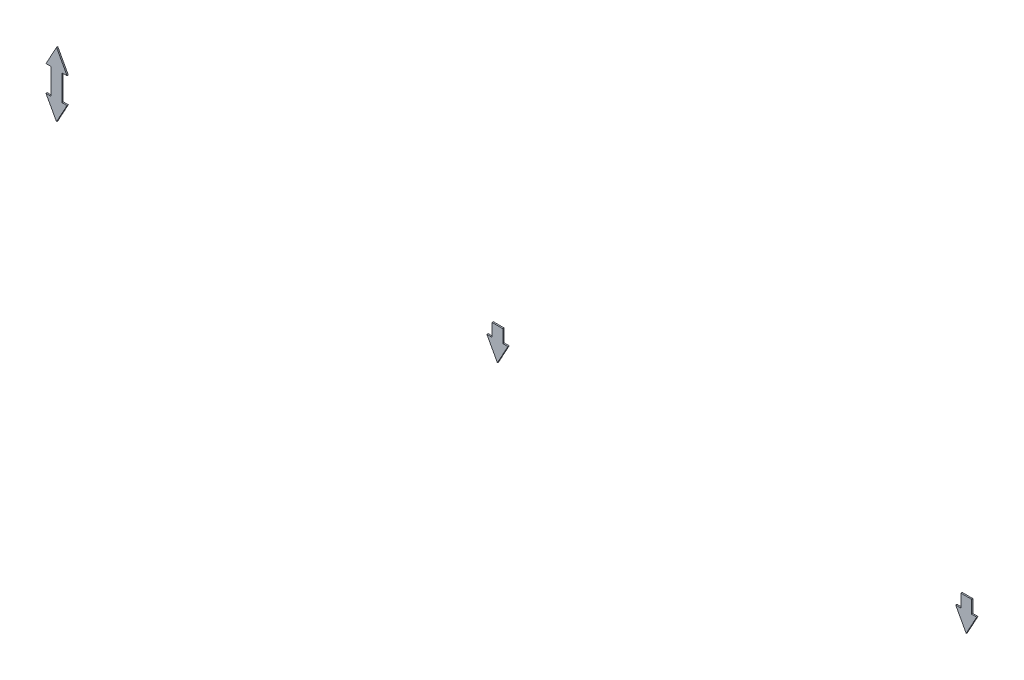
ISO-10303-21;
HEADER;
FILE_DESCRIPTION(('STEP AP214'),'2;1');
FILE_NAME('part.step','',(''),(''),'','','');
FILE_SCHEMA(('AUTOMOTIVE_DESIGN { 1 0 10303 214 1 1 1 1 }'));
ENDSEC;
DATA;
#1=APPLICATION_CONTEXT('core data for automotive mechanical design processes');
#2=APPLICATION_PROTOCOL_DEFINITION('international standard','automotive_design',2000,#1);
#3=PRODUCT_CONTEXT('',#1,'mechanical');
#4=PRODUCT('Part','Part','',(#3));
#5=PRODUCT_RELATED_PRODUCT_CATEGORY('part','',(#4));
#6=PRODUCT_DEFINITION_FORMATION('','',#4);
#7=PRODUCT_DEFINITION_CONTEXT('part definition',#1,'design');
#8=PRODUCT_DEFINITION('design','',#6,#7);
#9=PRODUCT_DEFINITION_SHAPE('','',#8);
#10=(LENGTH_UNIT() NAMED_UNIT(*) SI_UNIT(.MILLI.,.METRE.));
#11=(NAMED_UNIT(*) PLANE_ANGLE_UNIT() SI_UNIT($,.RADIAN.));
#12=(NAMED_UNIT(*) SI_UNIT($,.STERADIAN.) SOLID_ANGLE_UNIT());
#13=UNCERTAINTY_MEASURE_WITH_UNIT(LENGTH_MEASURE(1.E-05),#10,'distance_accuracy_value','');
#14=(GEOMETRIC_REPRESENTATION_CONTEXT(3) GLOBAL_UNCERTAINTY_ASSIGNED_CONTEXT((#13)) GLOBAL_UNIT_ASSIGNED_CONTEXT((#10,
#11,#12)) REPRESENTATION_CONTEXT('',''));
#15=CARTESIAN_POINT('',(0.,0.,0.));
#16=DIRECTION('',(0.,0.,1.));
#17=DIRECTION('',(1.,0.,0.));
#18=AXIS2_PLACEMENT_3D('',#15,#16,#17);
#19=CARTESIAN_POINT('',(28365.5486184684,1498.65057848952,30.));
#20=DIRECTION('',(0.,-1.,0.));
#21=DIRECTION('',(0.,0.,-1.));
#22=AXIS2_PLACEMENT_3D('',#19,#20,#21);
#23=PLANE('',#22);
#24=DIRECTION('',(-1.,0.,0.));
#25=VECTOR('',#24,1.);
#26=CARTESIAN_POINT('',(28365.5486184684,1498.65057848952,0.));
#27=LINE('',#26,#25);
#28=CARTESIAN_POINT('',(28615.5486184684,1498.65057848952,0.));
#29=VERTEX_POINT('',#28);
#30=CARTESIAN_POINT('',(28365.5486184684,1498.65057848952,0.));
#31=VERTEX_POINT('',#30);
#32=EDGE_CURVE('E134',#29,#31,#27,.T.);
#33=ORIENTED_EDGE('',*,*,#32,.T.);
#34=DIRECTION('',(0.,0.,-1.));
#35=VECTOR('',#34,1.);
#36=CARTESIAN_POINT('',(28365.5486184684,1498.65057848952,30.));
#37=LINE('',#36,#35);
#38=CARTESIAN_POINT('',(28365.5486184684,1498.65057848952,30.));
#39=VERTEX_POINT('',#38);
#40=EDGE_CURVE('E12',#39,#31,#37,.T.);
#41=ORIENTED_EDGE('',*,*,#40,.F.);
#42=DIRECTION('',(-1.,0.,0.));
#43=VECTOR('',#42,1.);
#44=CARTESIAN_POINT('',(28365.5486184684,1498.65057848952,30.));
#45=LINE('',#44,#43);
#46=CARTESIAN_POINT('',(28615.5486184684,1498.65057848952,30.));
#47=VERTEX_POINT('',#46);
#48=EDGE_CURVE('E146',#47,#39,#45,.T.);
#49=ORIENTED_EDGE('',*,*,#48,.F.);
#50=DIRECTION('',(0.,0.,-1.));
#51=VECTOR('',#50,1.);
#52=CARTESIAN_POINT('',(28615.5486184684,1498.65057848952,30.));
#53=LINE('',#52,#51);
#54=EDGE_CURVE('E130',#47,#29,#53,.T.);
#55=ORIENTED_EDGE('',*,*,#54,.T.);
#56=EDGE_LOOP('',(#33,#41,#49,#55));
#57=FACE_BOUND('',#56,.T.);
#58=ADVANCED_FACE('F44',(#57),#23,.F.);
#59=CARTESIAN_POINT('',(28365.5486184684,1198.65057848952,30.));
#60=DIRECTION('',(1.,0.,0.));
#61=DIRECTION('',(0.,0.,-1.));
#62=AXIS2_PLACEMENT_3D('',#59,#60,#61);
#63=PLANE('',#62);
#64=DIRECTION('',(0.,-1.,0.));
#65=VECTOR('',#64,1.);
#66=CARTESIAN_POINT('',(28365.5486184684,1198.65057848952,0.));
#67=LINE('',#66,#65);
#68=CARTESIAN_POINT('',(28365.5486184684,1198.65057848952,0.));
#69=VERTEX_POINT('',#68);
#70=EDGE_CURVE('E137',#31,#69,#67,.T.);
#71=ORIENTED_EDGE('',*,*,#70,.T.);
#72=DIRECTION('',(0.,0.,-1.));
#73=VECTOR('',#72,1.);
#74=CARTESIAN_POINT('',(28365.5486184684,1198.65057848952,30.));
#75=LINE('',#74,#73);
#76=CARTESIAN_POINT('',(28365.5486184684,1198.65057848952,30.));
#77=VERTEX_POINT('',#76);
#78=EDGE_CURVE('E52',#77,#69,#75,.T.);
#79=ORIENTED_EDGE('',*,*,#78,.F.);
#80=DIRECTION('',(0.,-1.,0.));
#81=VECTOR('',#80,1.);
#82=CARTESIAN_POINT('',(28365.5486184684,1198.65057848952,30.));
#83=LINE('',#82,#81);
#84=EDGE_CURVE('E100',#39,#77,#83,.T.);
#85=ORIENTED_EDGE('',*,*,#84,.F.);
#86=ORIENTED_EDGE('',*,*,#40,.T.);
#87=EDGE_LOOP('',(#71,#79,#85,#86));
#88=FACE_BOUND('',#87,.T.);
#89=ADVANCED_FACE('F171',(#88),#63,.F.);
#90=CARTESIAN_POINT('',(28365.5486184684,1198.65057848952,30.));
#91=DIRECTION('',(0.,-1.,0.));
#92=DIRECTION('',(0.,0.,-1.));
#93=AXIS2_PLACEMENT_3D('',#90,#91,#92);
#94=PLANE('',#93);
#95=DIRECTION('',(-1.,0.,0.));
#96=VECTOR('',#95,1.);
#97=CARTESIAN_POINT('',(28365.5486184684,1198.65057848952,0.));
#98=LINE('',#97,#96);
#99=CARTESIAN_POINT('',(28246.1263767895,1198.65057848952,0.));
#100=VERTEX_POINT('',#99);
#101=EDGE_CURVE('E139',#69,#100,#98,.T.);
#102=ORIENTED_EDGE('',*,*,#101,.T.);
#103=DIRECTION('',(0.,0.,-1.));
#104=VECTOR('',#103,1.);
#105=CARTESIAN_POINT('',(28246.1263767895,1198.65057848952,30.));
#106=LINE('',#105,#104);
#107=CARTESIAN_POINT('',(28246.1263767895,1198.65057848952,30.));
#108=VERTEX_POINT('',#107);
#109=EDGE_CURVE('E150',#108,#100,#106,.T.);
#110=ORIENTED_EDGE('',*,*,#109,.F.);
#111=DIRECTION('',(-1.,0.,0.));
#112=VECTOR('',#111,1.);
#113=CARTESIAN_POINT('',(28365.5486184684,1198.65057848952,30.));
#114=LINE('',#113,#112);
#115=EDGE_CURVE('E158',#77,#108,#114,.T.);
#116=ORIENTED_EDGE('',*,*,#115,.F.);
#117=ORIENTED_EDGE('',*,*,#78,.T.);
#118=EDGE_LOOP('',(#102,#110,#116,#117));
#119=FACE_BOUND('',#118,.T.);
#120=ADVANCED_FACE('F156',(#119),#94,.F.);
#121=CARTESIAN_POINT('',(28246.1263767895,1198.65057848952,30.));
#122=DIRECTION('',(0.878295572504541,0.478118068387841,0.));
#123=DIRECTION('',(-0.478118068387841,0.878295572504541,0.));
#124=AXIS2_PLACEMENT_3D('',#121,#122,#123);
#125=PLANE('',#124);
#126=DIRECTION('',(0.478118068387841,-0.878295572504541,0.));
#127=VECTOR('',#126,1.);
#128=CARTESIAN_POINT('',(28246.1263767895,1198.65057848952,0.));
#129=LINE('',#128,#127);
#130=CARTESIAN_POINT('',(28490.5486184684,749.650662188248,0.));
#131=VERTEX_POINT('',#130);
#132=EDGE_CURVE('E141',#100,#131,#129,.T.);
#133=ORIENTED_EDGE('',*,*,#132,.T.);
#134=DIRECTION('',(0.,0.,-1.));
#135=VECTOR('',#134,1.);
#136=CARTESIAN_POINT('',(28490.5486184684,749.650662188248,30.));
#137=LINE('',#136,#135);
#138=CARTESIAN_POINT('',(28490.5486184684,749.650662188248,30.));
#139=VERTEX_POINT('',#138);
#140=EDGE_CURVE('E125',#139,#131,#137,.T.);
#141=ORIENTED_EDGE('',*,*,#140,.F.);
#142=DIRECTION('',(0.478118068387841,-0.878295572504541,0.));
#143=VECTOR('',#142,1.);
#144=CARTESIAN_POINT('',(28246.1263767895,1198.65057848952,30.));
#145=LINE('',#144,#143);
#146=EDGE_CURVE('E116',#108,#139,#145,.T.);
#147=ORIENTED_EDGE('',*,*,#146,.F.);
#148=ORIENTED_EDGE('',*,*,#109,.T.);
#149=EDGE_LOOP('',(#133,#141,#147,#148));
#150=FACE_BOUND('',#149,.T.);
#151=ADVANCED_FACE('F164',(#150),#125,.F.);
#152=CARTESIAN_POINT('',(28734.9708601474,1198.65057848952,30.));
#153=DIRECTION('',(-0.878295572504541,0.478118068387841,0.));
#154=DIRECTION('',(-0.478118068387841,-0.878295572504541,0.));
#155=AXIS2_PLACEMENT_3D('',#152,#153,#154);
#156=PLANE('',#155);
#157=DIRECTION('',(0.478118068387841,0.878295572504541,0.));
#158=VECTOR('',#157,1.);
#159=CARTESIAN_POINT('',(28734.9708601474,1198.65057848952,0.));
#160=LINE('',#159,#158);
#161=CARTESIAN_POINT('',(28734.9708601474,1198.65057848952,0.));
#162=VERTEX_POINT('',#161);
#163=EDGE_CURVE('E124',#131,#162,#160,.T.);
#164=ORIENTED_EDGE('',*,*,#163,.T.);
#165=DIRECTION('',(0.,0.,-1.));
#166=VECTOR('',#165,1.);
#167=CARTESIAN_POINT('',(28734.9708601474,1198.65057848952,30.));
#168=LINE('',#167,#166);
#169=CARTESIAN_POINT('',(28734.9708601474,1198.65057848952,30.));
#170=VERTEX_POINT('',#169);
#171=EDGE_CURVE('E121',#170,#162,#168,.T.);
#172=ORIENTED_EDGE('',*,*,#171,.F.);
#173=DIRECTION('',(0.478118068387841,0.878295572504541,0.));
#174=VECTOR('',#173,1.);
#175=CARTESIAN_POINT('',(28734.9708601474,1198.65057848952,30.));
#176=LINE('',#175,#174);
#177=EDGE_CURVE('E110',#139,#170,#176,.T.);
#178=ORIENTED_EDGE('',*,*,#177,.F.);
#179=ORIENTED_EDGE('',*,*,#140,.T.);
#180=EDGE_LOOP('',(#164,#172,#178,#179));
#181=FACE_BOUND('',#180,.T.);
#182=ADVANCED_FACE('F122',(#181),#156,.F.);
#183=CARTESIAN_POINT('',(28615.5486184684,1198.65057848952,30.));
#184=DIRECTION('',(0.,-1.,0.));
#185=DIRECTION('',(0.,0.,-1.));
#186=AXIS2_PLACEMENT_3D('',#183,#184,#185);
#187=PLANE('',#186);
#188=DIRECTION('',(-1.,0.,0.));
#189=VECTOR('',#188,1.);
#190=CARTESIAN_POINT('',(28615.5486184684,1198.65057848952,0.));
#191=LINE('',#190,#189);
#192=CARTESIAN_POINT('',(28615.5486184684,1198.65057848952,0.));
#193=VERTEX_POINT('',#192);
#194=EDGE_CURVE('E86',#162,#193,#191,.T.);
#195=ORIENTED_EDGE('',*,*,#194,.T.);
#196=DIRECTION('',(0.,0.,-1.));
#197=VECTOR('',#196,1.);
#198=CARTESIAN_POINT('',(28615.5486184684,1198.65057848952,30.));
#199=LINE('',#198,#197);
#200=CARTESIAN_POINT('',(28615.5486184684,1198.65057848952,30.));
#201=VERTEX_POINT('',#200);
#202=EDGE_CURVE('E126',#201,#193,#199,.T.);
#203=ORIENTED_EDGE('',*,*,#202,.F.);
#204=DIRECTION('',(-1.,0.,0.));
#205=VECTOR('',#204,1.);
#206=CARTESIAN_POINT('',(28615.5486184684,1198.65057848952,30.));
#207=LINE('',#206,#205);
#208=EDGE_CURVE('E114',#170,#201,#207,.T.);
#209=ORIENTED_EDGE('',*,*,#208,.F.);
#210=ORIENTED_EDGE('',*,*,#171,.T.);
#211=EDGE_LOOP('',(#195,#203,#209,#210));
#212=FACE_BOUND('',#211,.T.);
#213=ADVANCED_FACE('F128',(#212),#187,.F.);
#214=CARTESIAN_POINT('',(28615.5486184684,1198.65057848952,30.));
#215=DIRECTION('',(-1.,0.,0.));
#216=DIRECTION('',(0.,0.,1.));
#217=AXIS2_PLACEMENT_3D('',#214,#215,#216);
#218=PLANE('',#217);
#219=DIRECTION('',(0.,1.,0.));
#220=VECTOR('',#219,1.);
#221=CARTESIAN_POINT('',(28615.5486184684,1198.65057848952,0.));
#222=LINE('',#221,#220);
#223=EDGE_CURVE('E92',#193,#29,#222,.T.);
#224=ORIENTED_EDGE('',*,*,#223,.T.);
#225=ORIENTED_EDGE('',*,*,#54,.F.);
#226=DIRECTION('',(0.,1.,0.));
#227=VECTOR('',#226,1.);
#228=CARTESIAN_POINT('',(28615.5486184684,1198.65057848952,30.));
#229=LINE('',#228,#227);
#230=EDGE_CURVE('E60',#201,#47,#229,.T.);
#231=ORIENTED_EDGE('',*,*,#230,.F.);
#232=ORIENTED_EDGE('',*,*,#202,.T.);
#233=EDGE_LOOP('',(#224,#225,#231,#232));
#234=FACE_BOUND('',#233,.T.);
#235=ADVANCED_FACE('F185',(#234),#218,.F.);
#236=CARTESIAN_POINT('',(28615.5486184684,1498.65057848952,30.));
#237=DIRECTION('',(0.,0.,1.));
#238=DIRECTION('',(1.,0.,0.));
#239=AXIS2_PLACEMENT_3D('',#236,#237,#238);
#240=PLANE('',#239);
#241=ORIENTED_EDGE('',*,*,#48,.T.);
#242=ORIENTED_EDGE('',*,*,#84,.T.);
#243=ORIENTED_EDGE('',*,*,#115,.T.);
#244=ORIENTED_EDGE('',*,*,#146,.T.);
#245=ORIENTED_EDGE('',*,*,#177,.T.);
#246=ORIENTED_EDGE('',*,*,#208,.T.);
#247=ORIENTED_EDGE('',*,*,#230,.T.);
#248=EDGE_LOOP('',(#241,#242,#243,#244,#245,#246,#247));
#249=FACE_BOUND('',#248,.T.);
#250=ADVANCED_FACE('F112',(#249),#240,.T.);
#251=CARTESIAN_POINT('',(28615.5486184684,1498.65057848952,0.));
#252=DIRECTION('',(0.,0.,1.));
#253=DIRECTION('',(1.,0.,0.));
#254=AXIS2_PLACEMENT_3D('',#251,#252,#253);
#255=PLANE('',#254);
#256=ORIENTED_EDGE('',*,*,#32,.F.);
#257=ORIENTED_EDGE('',*,*,#223,.F.);
#258=ORIENTED_EDGE('',*,*,#194,.F.);
#259=ORIENTED_EDGE('',*,*,#163,.F.);
#260=ORIENTED_EDGE('',*,*,#132,.F.);
#261=ORIENTED_EDGE('',*,*,#101,.F.);
#262=ORIENTED_EDGE('',*,*,#70,.F.);
#263=EDGE_LOOP('',(#256,#257,#258,#259,#260,#261,#262));
#264=FACE_BOUND('',#263,.T.);
#265=ADVANCED_FACE('F162',(#264),#255,.F.);
#266=CLOSED_SHELL('',(#58,#89,#120,#151,#182,#213,#235,#250,#265));
#267=MANIFOLD_SOLID_BREP('B2',#266);
#268=CARTESIAN_POINT('',(17465.5486184684,1498.65057848952,30.));
#269=DIRECTION('',(0.,-1.,0.));
#270=DIRECTION('',(0.,0.,-1.));
#271=AXIS2_PLACEMENT_3D('',#268,#269,#270);
#272=PLANE('',#271);
#273=DIRECTION('',(-1.,0.,0.));
#274=VECTOR('',#273,1.);
#275=CARTESIAN_POINT('',(17465.5486184684,1498.65057848952,0.));
#276=LINE('',#275,#274);
#277=CARTESIAN_POINT('',(17715.5486184684,1498.65057848952,0.));
#278=VERTEX_POINT('',#277);
#279=CARTESIAN_POINT('',(17465.5486184684,1498.65057848952,0.));
#280=VERTEX_POINT('',#279);
#281=EDGE_CURVE('E345',#278,#280,#276,.T.);
#282=ORIENTED_EDGE('',*,*,#281,.T.);
#283=DIRECTION('',(0.,0.,-1.));
#284=VECTOR('',#283,1.);
#285=CARTESIAN_POINT('',(17465.5486184684,1498.65057848952,30.));
#286=LINE('',#285,#284);
#287=CARTESIAN_POINT('',(17465.5486184684,1498.65057848952,30.));
#288=VERTEX_POINT('',#287);
#289=EDGE_CURVE('E42',#288,#280,#286,.T.);
#290=ORIENTED_EDGE('',*,*,#289,.F.);
#291=DIRECTION('',(-1.,0.,0.));
#292=VECTOR('',#291,1.);
#293=CARTESIAN_POINT('',(17465.5486184684,1498.65057848952,30.));
#294=LINE('',#293,#292);
#295=CARTESIAN_POINT('',(17715.5486184684,1498.65057848952,30.));
#296=VERTEX_POINT('',#295);
#297=EDGE_CURVE('E357',#296,#288,#294,.T.);
#298=ORIENTED_EDGE('',*,*,#297,.F.);
#299=DIRECTION('',(0.,0.,-1.));
#300=VECTOR('',#299,1.);
#301=CARTESIAN_POINT('',(17715.5486184684,1498.65057848952,30.));
#302=LINE('',#301,#300);
#303=EDGE_CURVE('E341',#296,#278,#302,.T.);
#304=ORIENTED_EDGE('',*,*,#303,.T.);
#305=EDGE_LOOP('',(#282,#290,#298,#304));
#306=FACE_BOUND('',#305,.T.);
#307=ADVANCED_FACE('F255',(#306),#272,.F.);
#308=CARTESIAN_POINT('',(17465.5486184684,1198.65057848952,30.));
#309=DIRECTION('',(1.,0.,0.));
#310=DIRECTION('',(0.,0.,-1.));
#311=AXIS2_PLACEMENT_3D('',#308,#309,#310);
#312=PLANE('',#311);
#313=DIRECTION('',(0.,-1.,0.));
#314=VECTOR('',#313,1.);
#315=CARTESIAN_POINT('',(17465.5486184684,1198.65057848952,0.));
#316=LINE('',#315,#314);
#317=CARTESIAN_POINT('',(17465.5486184684,1198.65057848952,0.));
#318=VERTEX_POINT('',#317);
#319=EDGE_CURVE('E348',#280,#318,#316,.T.);
#320=ORIENTED_EDGE('',*,*,#319,.T.);
#321=DIRECTION('',(0.,0.,-1.));
#322=VECTOR('',#321,1.);
#323=CARTESIAN_POINT('',(17465.5486184684,1198.65057848952,30.));
#324=LINE('',#323,#322);
#325=CARTESIAN_POINT('',(17465.5486184684,1198.65057848952,30.));
#326=VERTEX_POINT('',#325);
#327=EDGE_CURVE('E263',#326,#318,#324,.T.);
#328=ORIENTED_EDGE('',*,*,#327,.F.);
#329=DIRECTION('',(0.,-1.,0.));
#330=VECTOR('',#329,1.);
#331=CARTESIAN_POINT('',(17465.5486184684,1198.65057848952,30.));
#332=LINE('',#331,#330);
#333=EDGE_CURVE('E311',#288,#326,#332,.T.);
#334=ORIENTED_EDGE('',*,*,#333,.F.);
#335=ORIENTED_EDGE('',*,*,#289,.T.);
#336=EDGE_LOOP('',(#320,#328,#334,#335));
#337=FACE_BOUND('',#336,.T.);
#338=ADVANCED_FACE('F382',(#337),#312,.F.);
#339=CARTESIAN_POINT('',(17465.5486184684,1198.65057848952,30.));
#340=DIRECTION('',(0.,-1.,0.));
#341=DIRECTION('',(0.,0.,-1.));
#342=AXIS2_PLACEMENT_3D('',#339,#340,#341);
#343=PLANE('',#342);
#344=DIRECTION('',(-1.,0.,0.));
#345=VECTOR('',#344,1.);
#346=CARTESIAN_POINT('',(17465.5486184684,1198.65057848952,0.));
#347=LINE('',#346,#345);
#348=CARTESIAN_POINT('',(17346.1263767895,1198.65057848952,0.));
#349=VERTEX_POINT('',#348);
#350=EDGE_CURVE('E350',#318,#349,#347,.T.);
#351=ORIENTED_EDGE('',*,*,#350,.T.);
#352=DIRECTION('',(0.,0.,-1.));
#353=VECTOR('',#352,1.);
#354=CARTESIAN_POINT('',(17346.1263767895,1198.65057848952,30.));
#355=LINE('',#354,#353);
#356=CARTESIAN_POINT('',(17346.1263767895,1198.65057848952,30.));
#357=VERTEX_POINT('',#356);
#358=EDGE_CURVE('E361',#357,#349,#355,.T.);
#359=ORIENTED_EDGE('',*,*,#358,.F.);
#360=DIRECTION('',(-1.,0.,0.));
#361=VECTOR('',#360,1.);
#362=CARTESIAN_POINT('',(17465.5486184684,1198.65057848952,30.));
#363=LINE('',#362,#361);
#364=EDGE_CURVE('E369',#326,#357,#363,.T.);
#365=ORIENTED_EDGE('',*,*,#364,.F.);
#366=ORIENTED_EDGE('',*,*,#327,.T.);
#367=EDGE_LOOP('',(#351,#359,#365,#366));
#368=FACE_BOUND('',#367,.T.);
#369=ADVANCED_FACE('F367',(#368),#343,.F.);
#370=CARTESIAN_POINT('',(17346.1263767895,1198.65057848952,30.));
#371=DIRECTION('',(0.878295572504541,0.478118068387841,0.));
#372=DIRECTION('',(-0.478118068387841,0.878295572504541,0.));
#373=AXIS2_PLACEMENT_3D('',#370,#371,#372);
#374=PLANE('',#373);
#375=DIRECTION('',(0.478118068387841,-0.878295572504541,0.));
#376=VECTOR('',#375,1.);
#377=CARTESIAN_POINT('',(17346.1263767895,1198.65057848952,0.));
#378=LINE('',#377,#376);
#379=CARTESIAN_POINT('',(17590.5486184684,749.650662188248,0.));
#380=VERTEX_POINT('',#379);
#381=EDGE_CURVE('E352',#349,#380,#378,.T.);
#382=ORIENTED_EDGE('',*,*,#381,.T.);
#383=DIRECTION('',(0.,0.,-1.));
#384=VECTOR('',#383,1.);
#385=CARTESIAN_POINT('',(17590.5486184684,749.650662188248,30.));
#386=LINE('',#385,#384);
#387=CARTESIAN_POINT('',(17590.5486184684,749.650662188248,30.));
#388=VERTEX_POINT('',#387);
#389=EDGE_CURVE('E336',#388,#380,#386,.T.);
#390=ORIENTED_EDGE('',*,*,#389,.F.);
#391=DIRECTION('',(0.478118068387841,-0.878295572504541,0.));
#392=VECTOR('',#391,1.);
#393=CARTESIAN_POINT('',(17346.1263767895,1198.65057848952,30.));
#394=LINE('',#393,#392);
#395=EDGE_CURVE('E327',#357,#388,#394,.T.);
#396=ORIENTED_EDGE('',*,*,#395,.F.);
#397=ORIENTED_EDGE('',*,*,#358,.T.);
#398=EDGE_LOOP('',(#382,#390,#396,#397));
#399=FACE_BOUND('',#398,.T.);
#400=ADVANCED_FACE('F375',(#399),#374,.F.);
#401=CARTESIAN_POINT('',(17834.9708601474,1198.65057848952,30.));
#402=DIRECTION('',(-0.878295572504541,0.478118068387841,0.));
#403=DIRECTION('',(-0.478118068387841,-0.878295572504541,0.));
#404=AXIS2_PLACEMENT_3D('',#401,#402,#403);
#405=PLANE('',#404);
#406=DIRECTION('',(0.478118068387841,0.878295572504541,0.));
#407=VECTOR('',#406,1.);
#408=CARTESIAN_POINT('',(17834.9708601474,1198.65057848952,0.));
#409=LINE('',#408,#407);
#410=CARTESIAN_POINT('',(17834.9708601474,1198.65057848952,0.));
#411=VERTEX_POINT('',#410);
#412=EDGE_CURVE('E335',#380,#411,#409,.T.);
#413=ORIENTED_EDGE('',*,*,#412,.T.);
#414=DIRECTION('',(0.,0.,-1.));
#415=VECTOR('',#414,1.);
#416=CARTESIAN_POINT('',(17834.9708601474,1198.65057848952,30.));
#417=LINE('',#416,#415);
#418=CARTESIAN_POINT('',(17834.9708601474,1198.65057848952,30.));
#419=VERTEX_POINT('',#418);
#420=EDGE_CURVE('E332',#419,#411,#417,.T.);
#421=ORIENTED_EDGE('',*,*,#420,.F.);
#422=DIRECTION('',(0.478118068387841,0.878295572504541,0.));
#423=VECTOR('',#422,1.);
#424=CARTESIAN_POINT('',(17834.9708601474,1198.65057848952,30.));
#425=LINE('',#424,#423);
#426=EDGE_CURVE('E321',#388,#419,#425,.T.);
#427=ORIENTED_EDGE('',*,*,#426,.F.);
#428=ORIENTED_EDGE('',*,*,#389,.T.);
#429=EDGE_LOOP('',(#413,#421,#427,#428));
#430=FACE_BOUND('',#429,.T.);
#431=ADVANCED_FACE('F333',(#430),#405,.F.);
#432=CARTESIAN_POINT('',(17715.5486184684,1198.65057848952,30.));
#433=DIRECTION('',(0.,-1.,0.));
#434=DIRECTION('',(0.,0.,-1.));
#435=AXIS2_PLACEMENT_3D('',#432,#433,#434);
#436=PLANE('',#435);
#437=DIRECTION('',(-1.,0.,0.));
#438=VECTOR('',#437,1.);
#439=CARTESIAN_POINT('',(17715.5486184684,1198.65057848952,0.));
#440=LINE('',#439,#438);
#441=CARTESIAN_POINT('',(17715.5486184684,1198.65057848952,0.));
#442=VERTEX_POINT('',#441);
#443=EDGE_CURVE('E297',#411,#442,#440,.T.);
#444=ORIENTED_EDGE('',*,*,#443,.T.);
#445=DIRECTION('',(0.,0.,-1.));
#446=VECTOR('',#445,1.);
#447=CARTESIAN_POINT('',(17715.5486184684,1198.65057848952,30.));
#448=LINE('',#447,#446);
#449=CARTESIAN_POINT('',(17715.5486184684,1198.65057848952,30.));
#450=VERTEX_POINT('',#449);
#451=EDGE_CURVE('E337',#450,#442,#448,.T.);
#452=ORIENTED_EDGE('',*,*,#451,.F.);
#453=DIRECTION('',(-1.,0.,0.));
#454=VECTOR('',#453,1.);
#455=CARTESIAN_POINT('',(17715.5486184684,1198.65057848952,30.));
#456=LINE('',#455,#454);
#457=EDGE_CURVE('E325',#419,#450,#456,.T.);
#458=ORIENTED_EDGE('',*,*,#457,.F.);
#459=ORIENTED_EDGE('',*,*,#420,.T.);
#460=EDGE_LOOP('',(#444,#452,#458,#459));
#461=FACE_BOUND('',#460,.T.);
#462=ADVANCED_FACE('F339',(#461),#436,.F.);
#463=CARTESIAN_POINT('',(17715.5486184684,1198.65057848952,30.));
#464=DIRECTION('',(-1.,0.,0.));
#465=DIRECTION('',(0.,0.,1.));
#466=AXIS2_PLACEMENT_3D('',#463,#464,#465);
#467=PLANE('',#466);
#468=DIRECTION('',(0.,1.,0.));
#469=VECTOR('',#468,1.);
#470=CARTESIAN_POINT('',(17715.5486184684,1198.65057848952,0.));
#471=LINE('',#470,#469);
#472=EDGE_CURVE('E303',#442,#278,#471,.T.);
#473=ORIENTED_EDGE('',*,*,#472,.T.);
#474=ORIENTED_EDGE('',*,*,#303,.F.);
#475=DIRECTION('',(0.,1.,0.));
#476=VECTOR('',#475,1.);
#477=CARTESIAN_POINT('',(17715.5486184684,1198.65057848952,30.));
#478=LINE('',#477,#476);
#479=EDGE_CURVE('E271',#450,#296,#478,.T.);
#480=ORIENTED_EDGE('',*,*,#479,.F.);
#481=ORIENTED_EDGE('',*,*,#451,.T.);
#482=EDGE_LOOP('',(#473,#474,#480,#481));
#483=FACE_BOUND('',#482,.T.);
#484=ADVANCED_FACE('F396',(#483),#467,.F.);
#485=CARTESIAN_POINT('',(17715.5486184684,1498.65057848952,30.));
#486=DIRECTION('',(0.,0.,1.));
#487=DIRECTION('',(1.,0.,0.));
#488=AXIS2_PLACEMENT_3D('',#485,#486,#487);
#489=PLANE('',#488);
#490=ORIENTED_EDGE('',*,*,#297,.T.);
#491=ORIENTED_EDGE('',*,*,#333,.T.);
#492=ORIENTED_EDGE('',*,*,#364,.T.);
#493=ORIENTED_EDGE('',*,*,#395,.T.);
#494=ORIENTED_EDGE('',*,*,#426,.T.);
#495=ORIENTED_EDGE('',*,*,#457,.T.);
#496=ORIENTED_EDGE('',*,*,#479,.T.);
#497=EDGE_LOOP('',(#490,#491,#492,#493,#494,#495,#496));
#498=FACE_BOUND('',#497,.T.);
#499=ADVANCED_FACE('F323',(#498),#489,.T.);
#500=CARTESIAN_POINT('',(17715.5486184684,1498.65057848952,0.));
#501=DIRECTION('',(0.,0.,1.));
#502=DIRECTION('',(1.,0.,0.));
#503=AXIS2_PLACEMENT_3D('',#500,#501,#502);
#504=PLANE('',#503);
#505=ORIENTED_EDGE('',*,*,#281,.F.);
#506=ORIENTED_EDGE('',*,*,#472,.F.);
#507=ORIENTED_EDGE('',*,*,#443,.F.);
#508=ORIENTED_EDGE('',*,*,#412,.F.);
#509=ORIENTED_EDGE('',*,*,#381,.F.);
#510=ORIENTED_EDGE('',*,*,#350,.F.);
#511=ORIENTED_EDGE('',*,*,#319,.F.);
#512=EDGE_LOOP('',(#505,#506,#507,#508,#509,#510,#511));
#513=FACE_BOUND('',#512,.T.);
#514=ADVANCED_FACE('F373',(#513),#504,.F.);
#515=CLOSED_SHELL('',(#307,#338,#369,#400,#431,#462,#484,#499,#514));
#516=MANIFOLD_SOLID_BREP('B6',#515);
#517=CARTESIAN_POINT('',(7464.0512415667,1525.53062986048,30.));
#518=DIRECTION('',(0.,1.,0.));
#519=DIRECTION('',(0.,0.,1.));
#520=AXIS2_PLACEMENT_3D('',#517,#518,#519);
#521=PLANE('',#520);
#522=DIRECTION('',(1.,0.,0.));
#523=VECTOR('',#522,1.);
#524=CARTESIAN_POINT('',(7464.0512415667,1525.53062986048,0.));
#525=LINE('',#524,#523);
#526=CARTESIAN_POINT('',(7464.0512415667,1525.53062986048,0.));
#527=VERTEX_POINT('',#526);
#528=CARTESIAN_POINT('',(7583.47348324566,1525.53062986048,0.));
#529=VERTEX_POINT('',#528);
#530=EDGE_CURVE('E565',#527,#529,#525,.T.);
#531=ORIENTED_EDGE('',*,*,#530,.T.);
#532=DIRECTION('',(0.,0.,-1.));
#533=VECTOR('',#532,1.);
#534=CARTESIAN_POINT('',(7583.47348324566,1525.53062986048,30.));
#535=LINE('',#534,#533);
#536=CARTESIAN_POINT('',(7583.47348324566,1525.53062986048,30.));
#537=VERTEX_POINT('',#536);
#538=EDGE_CURVE('E253',#537,#529,#535,.T.);
#539=ORIENTED_EDGE('',*,*,#538,.F.);
#540=DIRECTION('',(1.,0.,0.));
#541=VECTOR('',#540,1.);
#542=CARTESIAN_POINT('',(7464.0512415667,1525.53062986048,30.));
#543=LINE('',#542,#541);
#544=CARTESIAN_POINT('',(7464.0512415667,1525.53062986048,30.));
#545=VERTEX_POINT('',#544);
#546=EDGE_CURVE('E583',#545,#537,#543,.T.);
#547=ORIENTED_EDGE('',*,*,#546,.F.);
#548=DIRECTION('',(0.,0.,-1.));
#549=VECTOR('',#548,1.);
#550=CARTESIAN_POINT('',(7464.0512415667,1525.53062986048,30.));
#551=LINE('',#550,#549);
#552=EDGE_CURVE('E561',#545,#527,#551,.T.);
#553=ORIENTED_EDGE('',*,*,#552,.T.);
#554=EDGE_LOOP('',(#531,#539,#547,#553));
#555=FACE_BOUND('',#554,.T.);
#556=ADVANCED_FACE('F457',(#555),#521,.F.);
#557=CARTESIAN_POINT('',(7583.47348324566,1525.53062986048,30.));
#558=DIRECTION('',(-0.878295572504543,-0.478118068387838,0.));
#559=DIRECTION('',(0.478118068387838,-0.878295572504543,0.));
#560=AXIS2_PLACEMENT_3D('',#557,#558,#559);
#561=PLANE('',#560);
#562=DIRECTION('',(-0.478118068387838,0.878295572504542,0.));
#563=VECTOR('',#562,1.);
#564=CARTESIAN_POINT('',(7583.47348324566,1525.53062986048,0.));
#565=LINE('',#564,#563);
#566=CARTESIAN_POINT('',(7339.0512415667,1974.53054616176,0.));
#567=VERTEX_POINT('',#566);
#568=EDGE_CURVE('E568',#529,#567,#565,.T.);
#569=ORIENTED_EDGE('',*,*,#568,.T.);
#570=DIRECTION('',(0.,0.,-1.));
#571=VECTOR('',#570,1.);
#572=CARTESIAN_POINT('',(7339.0512415667,1974.53054616176,30.));
#573=LINE('',#572,#571);
#574=CARTESIAN_POINT('',(7339.0512415667,1974.53054616176,30.));
#575=VERTEX_POINT('',#574);
#576=EDGE_CURVE('E465',#575,#567,#573,.T.);
#577=ORIENTED_EDGE('',*,*,#576,.F.);
#578=DIRECTION('',(-0.478118068387838,0.878295572504542,0.));
#579=VECTOR('',#578,1.);
#580=CARTESIAN_POINT('',(7583.47348324566,1525.53062986048,30.));
#581=LINE('',#580,#579);
#582=EDGE_CURVE('E522',#537,#575,#581,.T.);
#583=ORIENTED_EDGE('',*,*,#582,.F.);
#584=ORIENTED_EDGE('',*,*,#538,.T.);
#585=EDGE_LOOP('',(#569,#577,#583,#584));
#586=FACE_BOUND('',#585,.T.);
#587=ADVANCED_FACE('F632',(#586),#561,.F.);
#588=CARTESIAN_POINT('',(7094.62899988774,1525.53062986048,30.));
#589=DIRECTION('',(0.878295572504543,-0.478118068387838,0.));
#590=DIRECTION('',(0.478118068387838,0.878295572504543,0.));
#591=AXIS2_PLACEMENT_3D('',#588,#589,#590);
#592=PLANE('',#591);
#593=DIRECTION('',(-0.478118068387838,-0.878295572504542,0.));
#594=VECTOR('',#593,1.);
#595=CARTESIAN_POINT('',(7094.62899988774,1525.53062986048,0.));
#596=LINE('',#595,#594);
#597=CARTESIAN_POINT('',(7094.62899988774,1525.53062986048,0.));
#598=VERTEX_POINT('',#597);
#599=EDGE_CURVE('E570',#567,#598,#596,.T.);
#600=ORIENTED_EDGE('',*,*,#599,.T.);
#601=DIRECTION('',(0.,0.,-1.));
#602=VECTOR('',#601,1.);
#603=CARTESIAN_POINT('',(7094.62899988774,1525.53062986048,30.));
#604=LINE('',#603,#602);
#605=CARTESIAN_POINT('',(7094.62899988774,1525.53062986048,30.));
#606=VERTEX_POINT('',#605);
#607=EDGE_CURVE('E596',#606,#598,#604,.T.);
#608=ORIENTED_EDGE('',*,*,#607,.F.);
#609=DIRECTION('',(-0.478118068387838,-0.878295572504542,0.));
#610=VECTOR('',#609,1.);
#611=CARTESIAN_POINT('',(7094.62899988774,1525.53062986048,30.));
#612=LINE('',#611,#610);
#613=EDGE_CURVE('E604',#575,#606,#612,.T.);
#614=ORIENTED_EDGE('',*,*,#613,.F.);
#615=ORIENTED_EDGE('',*,*,#576,.T.);
#616=EDGE_LOOP('',(#600,#608,#614,#615));
#617=FACE_BOUND('',#616,.T.);
#618=ADVANCED_FACE('F602',(#617),#592,.F.);
#619=CARTESIAN_POINT('',(7214.0512415667,1525.53062986048,30.));
#620=DIRECTION('',(0.,1.,0.));
#621=DIRECTION('',(0.,0.,1.));
#622=AXIS2_PLACEMENT_3D('',#619,#620,#621);
#623=PLANE('',#622);
#624=DIRECTION('',(1.,0.,0.));
#625=VECTOR('',#624,1.);
#626=CARTESIAN_POINT('',(7214.0512415667,1525.53062986048,0.));
#627=LINE('',#626,#625);
#628=CARTESIAN_POINT('',(7214.0512415667,1525.53062986048,0.));
#629=VERTEX_POINT('',#628);
#630=EDGE_CURVE('E572',#598,#629,#627,.T.);
#631=ORIENTED_EDGE('',*,*,#630,.T.);
#632=DIRECTION('',(0.,0.,-1.));
#633=VECTOR('',#632,1.);
#634=CARTESIAN_POINT('',(7214.0512415667,1525.53062986048,30.));
#635=LINE('',#634,#633);
#636=CARTESIAN_POINT('',(7214.0512415667,1525.53062986048,30.));
#637=VERTEX_POINT('',#636);
#638=EDGE_CURVE('E593',#637,#629,#635,.T.);
#639=ORIENTED_EDGE('',*,*,#638,.F.);
#640=DIRECTION('',(1.,0.,0.));
#641=VECTOR('',#640,1.);
#642=CARTESIAN_POINT('',(7214.0512415667,1525.53062986048,30.));
#643=LINE('',#642,#641);
#644=EDGE_CURVE('E622',#606,#637,#643,.T.);
#645=ORIENTED_EDGE('',*,*,#644,.F.);
#646=ORIENTED_EDGE('',*,*,#607,.T.);
#647=EDGE_LOOP('',(#631,#639,#645,#646));
#648=FACE_BOUND('',#647,.T.);
#649=ADVANCED_FACE('F613',(#648),#623,.F.);
#650=CARTESIAN_POINT('',(7214.0512415667,925.530629860483,30.));
#651=DIRECTION('',(1.,0.,0.));
#652=DIRECTION('',(0.,0.,-1.));
#653=AXIS2_PLACEMENT_3D('',#650,#651,#652);
#654=PLANE('',#653);
#655=DIRECTION('',(0.,-1.,0.));
#656=VECTOR('',#655,1.);
#657=CARTESIAN_POINT('',(7214.0512415667,925.530629860483,0.));
#658=LINE('',#657,#656);
#659=CARTESIAN_POINT('',(7214.0512415667,925.530629860483,0.));
#660=VERTEX_POINT('',#659);
#661=EDGE_CURVE('E574',#629,#660,#658,.T.);
#662=ORIENTED_EDGE('',*,*,#661,.T.);
#663=DIRECTION('',(0.,0.,-1.));
#664=VECTOR('',#663,1.);
#665=CARTESIAN_POINT('',(7214.0512415667,925.530629860483,30.));
#666=LINE('',#665,#664);
#667=CARTESIAN_POINT('',(7214.0512415667,925.530629860483,30.));
#668=VERTEX_POINT('',#667);
#669=EDGE_CURVE('E590',#668,#660,#666,.T.);
#670=ORIENTED_EDGE('',*,*,#669,.F.);
#671=DIRECTION('',(0.,-1.,0.));
#672=VECTOR('',#671,1.);
#673=CARTESIAN_POINT('',(7214.0512415667,925.530629860483,30.));
#674=LINE('',#673,#672);
#675=EDGE_CURVE('E619',#637,#668,#674,.T.);
#676=ORIENTED_EDGE('',*,*,#675,.F.);
#677=ORIENTED_EDGE('',*,*,#638,.T.);
#678=EDGE_LOOP('',(#662,#670,#676,#677));
#679=FACE_BOUND('',#678,.T.);
#680=ADVANCED_FACE('F617',(#679),#654,.F.);
#681=CARTESIAN_POINT('',(7214.0512415667,925.530629860483,30.));
#682=DIRECTION('',(0.,-1.,0.));
#683=DIRECTION('',(0.,0.,-1.));
#684=AXIS2_PLACEMENT_3D('',#681,#682,#683);
#685=PLANE('',#684);
#686=DIRECTION('',(-1.,0.,0.));
#687=VECTOR('',#686,1.);
#688=CARTESIAN_POINT('',(7214.0512415667,925.530629860483,0.));
#689=LINE('',#688,#687);
#690=CARTESIAN_POINT('',(7094.62899988775,925.530629860483,0.));
#691=VERTEX_POINT('',#690);
#692=EDGE_CURVE('E576',#660,#691,#689,.T.);
#693=ORIENTED_EDGE('',*,*,#692,.T.);
#694=DIRECTION('',(0.,0.,-1.));
#695=VECTOR('',#694,1.);
#696=CARTESIAN_POINT('',(7094.62899988775,925.530629860483,30.));
#697=LINE('',#696,#695);
#698=CARTESIAN_POINT('',(7094.62899988775,925.530629860483,30.));
#699=VERTEX_POINT('',#698);
#700=EDGE_CURVE('E587',#699,#691,#697,.T.);
#701=ORIENTED_EDGE('',*,*,#700,.F.);
#702=DIRECTION('',(-1.,0.,0.));
#703=VECTOR('',#702,1.);
#704=CARTESIAN_POINT('',(7214.0512415667,925.530629860483,30.));
#705=LINE('',#704,#703);
#706=EDGE_CURVE('E621',#668,#699,#705,.T.);
#707=ORIENTED_EDGE('',*,*,#706,.F.);
#708=ORIENTED_EDGE('',*,*,#669,.T.);
#709=EDGE_LOOP('',(#693,#701,#707,#708));
#710=FACE_BOUND('',#709,.T.);
#711=ADVANCED_FACE('F644',(#710),#685,.F.);
#712=CARTESIAN_POINT('',(7094.62899988775,925.530629860483,30.));
#713=DIRECTION('',(0.878295572504544,0.478118068387836,0.));
#714=DIRECTION('',(-0.478118068387836,0.878295572504544,0.));
#715=AXIS2_PLACEMENT_3D('',#712,#713,#714);
#716=PLANE('',#715);
#717=DIRECTION('',(0.478118068387836,-0.878295572504544,0.));
#718=VECTOR('',#717,1.);
#719=CARTESIAN_POINT('',(7094.62899988775,925.530629860483,0.));
#720=LINE('',#719,#718);
#721=CARTESIAN_POINT('',(7339.0512415667,476.530713559211,0.));
#722=VERTEX_POINT('',#721);
#723=EDGE_CURVE('E578',#691,#722,#720,.T.);
#724=ORIENTED_EDGE('',*,*,#723,.T.);
#725=DIRECTION('',(0.,0.,-1.));
#726=VECTOR('',#725,1.);
#727=CARTESIAN_POINT('',(7339.0512415667,476.530713559211,30.));
#728=LINE('',#727,#726);
#729=CARTESIAN_POINT('',(7339.0512415667,476.530713559211,30.));
#730=VERTEX_POINT('',#729);
#731=EDGE_CURVE('E556',#730,#722,#728,.T.);
#732=ORIENTED_EDGE('',*,*,#731,.F.);
#733=DIRECTION('',(0.478118068387836,-0.878295572504544,0.));
#734=VECTOR('',#733,1.);
#735=CARTESIAN_POINT('',(7094.62899988775,925.530629860483,30.));
#736=LINE('',#735,#734);
#737=EDGE_CURVE('E547',#699,#730,#736,.T.);
#738=ORIENTED_EDGE('',*,*,#737,.F.);
#739=ORIENTED_EDGE('',*,*,#700,.T.);
#740=EDGE_LOOP('',(#724,#732,#738,#739));
#741=FACE_BOUND('',#740,.T.);
#742=ADVANCED_FACE('F647',(#741),#716,.F.);
#743=CARTESIAN_POINT('',(7583.47348324567,925.530629860483,30.));
#744=DIRECTION('',(-0.878295572504541,0.478118068387841,0.));
#745=DIRECTION('',(-0.478118068387841,-0.878295572504541,0.));
#746=AXIS2_PLACEMENT_3D('',#743,#744,#745);
#747=PLANE('',#746);
#748=DIRECTION('',(0.478118068387841,0.878295572504541,0.));
#749=VECTOR('',#748,1.);
#750=CARTESIAN_POINT('',(7583.47348324567,925.530629860483,0.));
#751=LINE('',#750,#749);
#752=CARTESIAN_POINT('',(7583.47348324567,925.530629860483,0.));
#753=VERTEX_POINT('',#752);
#754=EDGE_CURVE('E555',#722,#753,#751,.T.);
#755=ORIENTED_EDGE('',*,*,#754,.T.);
#756=DIRECTION('',(0.,0.,-1.));
#757=VECTOR('',#756,1.);
#758=CARTESIAN_POINT('',(7583.47348324567,925.530629860483,30.));
#759=LINE('',#758,#757);
#760=CARTESIAN_POINT('',(7583.47348324567,925.530629860483,30.));
#761=VERTEX_POINT('',#760);
#762=EDGE_CURVE('E552',#761,#753,#759,.T.);
#763=ORIENTED_EDGE('',*,*,#762,.F.);
#764=DIRECTION('',(0.478118068387841,0.878295572504541,0.));
#765=VECTOR('',#764,1.);
#766=CARTESIAN_POINT('',(7583.47348324567,925.530629860483,30.));
#767=LINE('',#766,#765);
#768=EDGE_CURVE('E541',#730,#761,#767,.T.);
#769=ORIENTED_EDGE('',*,*,#768,.F.);
#770=ORIENTED_EDGE('',*,*,#731,.T.);
#771=EDGE_LOOP('',(#755,#763,#769,#770));
#772=FACE_BOUND('',#771,.T.);
#773=ADVANCED_FACE('F553',(#772),#747,.F.);
#774=CARTESIAN_POINT('',(7464.0512415667,925.530629860483,30.));
#775=DIRECTION('',(0.,-1.,0.));
#776=DIRECTION('',(0.,0.,-1.));
#777=AXIS2_PLACEMENT_3D('',#774,#775,#776);
#778=PLANE('',#777);
#779=DIRECTION('',(-1.,0.,0.));
#780=VECTOR('',#779,1.);
#781=CARTESIAN_POINT('',(7464.0512415667,925.530629860483,0.));
#782=LINE('',#781,#780);
#783=CARTESIAN_POINT('',(7464.0512415667,925.530629860483,0.));
#784=VERTEX_POINT('',#783);
#785=EDGE_CURVE('E508',#753,#784,#782,.T.);
#786=ORIENTED_EDGE('',*,*,#785,.T.);
#787=DIRECTION('',(0.,0.,-1.));
#788=VECTOR('',#787,1.);
#789=CARTESIAN_POINT('',(7464.0512415667,925.530629860483,30.));
#790=LINE('',#789,#788);
#791=CARTESIAN_POINT('',(7464.0512415667,925.530629860483,30.));
#792=VERTEX_POINT('',#791);
#793=EDGE_CURVE('E557',#792,#784,#790,.T.);
#794=ORIENTED_EDGE('',*,*,#793,.F.);
#795=DIRECTION('',(-1.,0.,0.));
#796=VECTOR('',#795,1.);
#797=CARTESIAN_POINT('',(7464.0512415667,925.530629860483,30.));
#798=LINE('',#797,#796);
#799=EDGE_CURVE('E545',#761,#792,#798,.T.);
#800=ORIENTED_EDGE('',*,*,#799,.F.);
#801=ORIENTED_EDGE('',*,*,#762,.T.);
#802=EDGE_LOOP('',(#786,#794,#800,#801));
#803=FACE_BOUND('',#802,.T.);
#804=ADVANCED_FACE('F559',(#803),#778,.F.);
#805=CARTESIAN_POINT('',(7464.0512415667,925.530629860483,30.));
#806=DIRECTION('',(-1.,0.,0.));
#807=DIRECTION('',(0.,0.,1.));
#808=AXIS2_PLACEMENT_3D('',#805,#806,#807);
#809=PLANE('',#808);
#810=DIRECTION('',(0.,1.,0.));
#811=VECTOR('',#810,1.);
#812=CARTESIAN_POINT('',(7464.0512415667,925.530629860483,0.));
#813=LINE('',#812,#811);
#814=EDGE_CURVE('E514',#784,#527,#813,.T.);
#815=ORIENTED_EDGE('',*,*,#814,.T.);
#816=ORIENTED_EDGE('',*,*,#552,.F.);
#817=DIRECTION('',(0.,1.,0.));
#818=VECTOR('',#817,1.);
#819=CARTESIAN_POINT('',(7464.0512415667,925.530629860483,30.));
#820=LINE('',#819,#818);
#821=EDGE_CURVE('E473',#792,#545,#820,.T.);
#822=ORIENTED_EDGE('',*,*,#821,.F.);
#823=ORIENTED_EDGE('',*,*,#793,.T.);
#824=EDGE_LOOP('',(#815,#816,#822,#823));
#825=FACE_BOUND('',#824,.T.);
#826=ADVANCED_FACE('F656',(#825),#809,.F.);
#827=CARTESIAN_POINT('',(7214.0512415667,1525.53062986048,30.));
#828=DIRECTION('',(0.,0.,1.));
#829=DIRECTION('',(1.,0.,0.));
#830=AXIS2_PLACEMENT_3D('',#827,#828,#829);
#831=PLANE('',#830);
#832=ORIENTED_EDGE('',*,*,#546,.T.);
#833=ORIENTED_EDGE('',*,*,#582,.T.);
#834=ORIENTED_EDGE('',*,*,#613,.T.);
#835=ORIENTED_EDGE('',*,*,#644,.T.);
#836=ORIENTED_EDGE('',*,*,#675,.T.);
#837=ORIENTED_EDGE('',*,*,#706,.T.);
#838=ORIENTED_EDGE('',*,*,#737,.T.);
#839=ORIENTED_EDGE('',*,*,#768,.T.);
#840=ORIENTED_EDGE('',*,*,#799,.T.);
#841=ORIENTED_EDGE('',*,*,#821,.T.);
#842=EDGE_LOOP('',(#832,#833,#834,#835,#836,#837,#838,#839,#840,#841));
#843=FACE_BOUND('',#842,.T.);
#844=ADVANCED_FACE('F543',(#843),#831,.T.);
#845=CARTESIAN_POINT('',(7214.0512415667,1525.53062986048,0.));
#846=DIRECTION('',(0.,0.,1.));
#847=DIRECTION('',(1.,0.,0.));
#848=AXIS2_PLACEMENT_3D('',#845,#846,#847);
#849=PLANE('',#848);
#850=ORIENTED_EDGE('',*,*,#530,.F.);
#851=ORIENTED_EDGE('',*,*,#814,.F.);
#852=ORIENTED_EDGE('',*,*,#785,.F.);
#853=ORIENTED_EDGE('',*,*,#754,.F.);
#854=ORIENTED_EDGE('',*,*,#723,.F.);
#855=ORIENTED_EDGE('',*,*,#692,.F.);
#856=ORIENTED_EDGE('',*,*,#661,.F.);
#857=ORIENTED_EDGE('',*,*,#630,.F.);
#858=ORIENTED_EDGE('',*,*,#599,.F.);
#859=ORIENTED_EDGE('',*,*,#568,.F.);
#860=EDGE_LOOP('',(#850,#851,#852,#853,#854,#855,#856,#857,#858,#859));
#861=FACE_BOUND('',#860,.T.);
#862=ADVANCED_FACE('F608',(#861),#849,.F.);
#863=CLOSED_SHELL('',(#556,#587,#618,#649,#680,#711,#742,#773,#804,#826,#844,#862));
#864=MANIFOLD_SOLID_BREP('B36',#863);
#865=ADVANCED_BREP_SHAPE_REPRESENTATION('',(#18,#267,#516,#864),#14);
#866=SHAPE_DEFINITION_REPRESENTATION(#9,#865);
ENDSEC;
END-ISO-10303-21;
